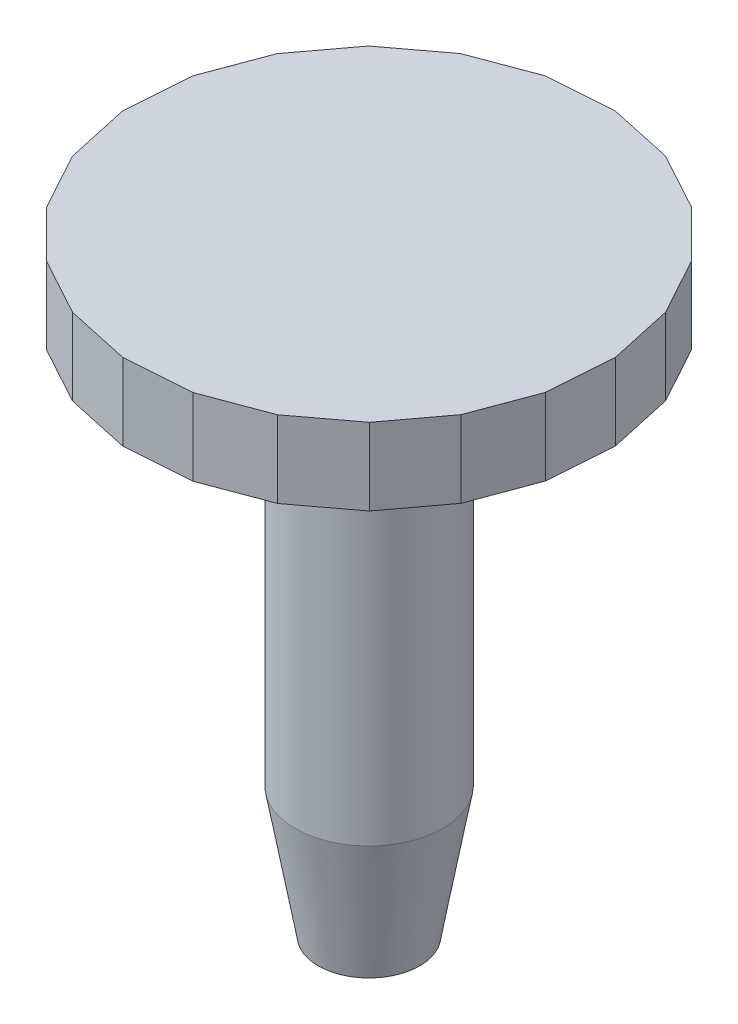
ISO-10303-21;
HEADER;
FILE_DESCRIPTION(('STEP AP214'),'2;1');
FILE_NAME('part.step','',(''),(''),'','','');
FILE_SCHEMA(('AUTOMOTIVE_DESIGN { 1 0 10303 214 1 1 1 1 }'));
ENDSEC;
DATA;
#1=APPLICATION_CONTEXT('core data for automotive mechanical design processes');
#2=APPLICATION_PROTOCOL_DEFINITION('international standard','automotive_design',2000,#1);
#3=PRODUCT_CONTEXT('',#1,'mechanical');
#4=PRODUCT('Part','Part','',(#3));
#5=PRODUCT_RELATED_PRODUCT_CATEGORY('part','',(#4));
#6=PRODUCT_DEFINITION_FORMATION('','',#4);
#7=PRODUCT_DEFINITION_CONTEXT('part definition',#1,'design');
#8=PRODUCT_DEFINITION('design','',#6,#7);
#9=PRODUCT_DEFINITION_SHAPE('','',#8);
#10=(LENGTH_UNIT() NAMED_UNIT(*) SI_UNIT(.MILLI.,.METRE.));
#11=(NAMED_UNIT(*) PLANE_ANGLE_UNIT() SI_UNIT($,.RADIAN.));
#12=(NAMED_UNIT(*) SI_UNIT($,.STERADIAN.) SOLID_ANGLE_UNIT());
#13=UNCERTAINTY_MEASURE_WITH_UNIT(LENGTH_MEASURE(1.E-05),#10,'distance_accuracy_value','');
#14=(GEOMETRIC_REPRESENTATION_CONTEXT(3) GLOBAL_UNCERTAINTY_ASSIGNED_CONTEXT((#13)) GLOBAL_UNIT_ASSIGNED_CONTEXT((#10,
#11,#12)) REPRESENTATION_CONTEXT('',''));
#15=CARTESIAN_POINT('',(0.,0.,0.));
#16=DIRECTION('',(0.,0.,1.));
#17=DIRECTION('',(1.,0.,0.));
#18=AXIS2_PLACEMENT_3D('',#15,#16,#17);
#19=CARTESIAN_POINT('',(0.,0.,0.));
#20=DIRECTION('',(0.,1.,0.));
#21=DIRECTION('',(0.,0.,1.));
#22=AXIS2_PLACEMENT_3D('',#19,#20,#21);
#23=CONICAL_SURFACE('',#22,3.048,0.174532925199433);
#24=CARTESIAN_POINT('',(0.,-5.3975,0.));
#25=DIRECTION('',(0.,1.,0.));
#26=DIRECTION('',(0.,0.,1.));
#27=AXIS2_PLACEMENT_3D('',#24,#25,#26);
#28=CIRCLE('',#27,2.09627512162606);
#29=CARTESIAN_POINT('',(0.,-5.3975,2.09627512162606));
#30=VERTEX_POINT('',#29);
#31=EDGE_CURVE('E11',#30,#30,#28,.T.);
#32=ORIENTED_EDGE('',*,*,#31,.T.);
#33=EDGE_LOOP('',(#32));
#34=FACE_BOUND('',#33,.T.);
#35=CARTESIAN_POINT('',(0.,0.,0.));
#36=DIRECTION('',(0.,1.,0.));
#37=DIRECTION('',(0.,0.,1.));
#38=AXIS2_PLACEMENT_3D('',#35,#36,#37);
#39=CIRCLE('',#38,3.048);
#40=CARTESIAN_POINT('',(0.,0.,3.048));
#41=VERTEX_POINT('',#40);
#42=EDGE_CURVE('E48',#41,#41,#39,.T.);
#43=ORIENTED_EDGE('',*,*,#42,.F.);
#44=EDGE_LOOP('',(#43));
#45=FACE_BOUND('',#44,.T.);
#46=ADVANCED_FACE('F39',(#34,#45),#23,.T.);
#47=CARTESIAN_POINT('',(0.,-5.3975,0.));
#48=DIRECTION('',(0.,1.,0.));
#49=DIRECTION('',(0.,0.,1.));
#50=AXIS2_PLACEMENT_3D('',#47,#48,#49);
#51=PLANE('',#50);
#52=ORIENTED_EDGE('',*,*,#31,.F.);
#53=EDGE_LOOP('',(#52));
#54=FACE_BOUND('',#53,.T.);
#55=ADVANCED_FACE('F381',(#54),#51,.F.);
#56=CARTESIAN_POINT('',(0.,14.986,0.));
#57=DIRECTION('',(0.,-1.,0.));
#58=DIRECTION('',(0.,0.,-1.));
#59=AXIS2_PLACEMENT_3D('',#56,#57,#58);
#60=CYLINDRICAL_SURFACE('',#59,3.048);
#61=CARTESIAN_POINT('',(0.,14.986,0.));
#62=DIRECTION('',(0.,1.,0.));
#63=DIRECTION('',(0.,0.,1.));
#64=AXIS2_PLACEMENT_3D('',#61,#62,#63);
#65=CIRCLE('',#64,3.048);
#66=CARTESIAN_POINT('',(0.,14.986,3.048));
#67=VERTEX_POINT('',#66);
#68=EDGE_CURVE('E371',#67,#67,#65,.T.);
#69=ORIENTED_EDGE('',*,*,#68,.F.);
#70=EDGE_LOOP('',(#69));
#71=FACE_BOUND('',#70,.T.);
#72=ORIENTED_EDGE('',*,*,#42,.T.);
#73=EDGE_LOOP('',(#72));
#74=FACE_BOUND('',#73,.T.);
#75=ADVANCED_FACE('F378',(#71,#74),#60,.T.);
#76=CARTESIAN_POINT('',(0.,14.986,0.));
#77=DIRECTION('',(0.,1.,0.));
#78=DIRECTION('',(0.,0.,1.));
#79=AXIS2_PLACEMENT_3D('',#76,#77,#78);
#80=CONICAL_SURFACE('',#79,3.048,1.30899693899575);
#81=CARTESIAN_POINT('',(0.,16.5735,0.));
#82=DIRECTION('',(0.,1.,0.));
#83=DIRECTION('',(0.,0.,1.));
#84=AXIS2_PLACEMENT_3D('',#81,#82,#83);
#85=CIRCLE('',#84,8.97263065701564);
#86=CARTESIAN_POINT('',(0.,16.5735,8.97263065701564));
#87=VERTEX_POINT('',#86);
#88=EDGE_CURVE('E367',#87,#87,#85,.T.);
#89=ORIENTED_EDGE('',*,*,#88,.F.);
#90=EDGE_LOOP('',(#89));
#91=FACE_BOUND('',#90,.T.);
#92=ORIENTED_EDGE('',*,*,#68,.T.);
#93=EDGE_LOOP('',(#92));
#94=FACE_BOUND('',#93,.T.);
#95=ADVANCED_FACE('F391',(#91,#94),#80,.T.);
#96=CARTESIAN_POINT('',(5.69900035977122,19.7485,-7.63197352585343));
#97=DIRECTION('',(-0.478199440981718,0.,0.878251270790297));
#98=DIRECTION('',(0.878251270790298,0.,0.478199440981718));
#99=AXIS2_PLACEMENT_3D('',#96,#97,#98);
#100=PLANE('',#99);
#101=DIRECTION('',(-0.878251270790298,0.,-0.478199440981718));
#102=VECTOR('',#101,1.);
#103=CARTESIAN_POINT('',(5.69900035977122,16.5735,-7.63197352585343));
#104=LINE('',#103,#102);
#105=CARTESIAN_POINT('',(5.69900035977122,16.5735,-7.63197352585343));
#106=VERTEX_POINT('',#105);
#107=CARTESIAN_POINT('',(3.31797538664219,16.5735,-8.9284189156668));
#108=VERTEX_POINT('',#107);
#109=EDGE_CURVE('E225',#106,#108,#104,.T.);
#110=ORIENTED_EDGE('',*,*,#109,.T.);
#111=DIRECTION('',(0.,-1.,0.));
#112=VECTOR('',#111,1.);
#113=CARTESIAN_POINT('',(3.31797538664219,19.7485,-8.9284189156668));
#114=LINE('',#113,#112);
#115=CARTESIAN_POINT('',(3.31797538664219,19.7485,-8.9284189156668));
#116=VERTEX_POINT('',#115);
#117=EDGE_CURVE('E364',#116,#108,#114,.T.);
#118=ORIENTED_EDGE('',*,*,#117,.F.);
#119=DIRECTION('',(-0.878251270790298,0.,-0.478199440981718));
#120=VECTOR('',#119,1.);
#121=CARTESIAN_POINT('',(5.69900035977122,19.7485,-7.63197352585343));
#122=LINE('',#121,#120);
#123=CARTESIAN_POINT('',(5.69900035977122,19.7485,-7.63197352585343));
#124=VERTEX_POINT('',#123);
#125=EDGE_CURVE('E289',#124,#116,#122,.T.);
#126=ORIENTED_EDGE('',*,*,#125,.F.);
#127=DIRECTION('',(0.,-1.,0.));
#128=VECTOR('',#127,1.);
#129=CARTESIAN_POINT('',(5.69900035977122,19.7485,-7.63197352585343));
#130=LINE('',#129,#128);
#131=EDGE_CURVE('E221',#124,#106,#130,.T.);
#132=ORIENTED_EDGE('',*,*,#131,.T.);
#133=EDGE_LOOP('',(#110,#118,#126,#132));
#134=FACE_BOUND('',#133,.T.);
#135=ADVANCED_FACE('F397',(#134),#100,.F.);
#136=CARTESIAN_POINT('',(3.31797538664219,19.7485,-8.9284189156668));
#137=DIRECTION('',(-0.211397027539353,0.,0.977400274579216));
#138=DIRECTION('',(0.977400274579216,0.,0.211397027539353));
#139=AXIS2_PLACEMENT_3D('',#136,#137,#138);
#140=PLANE('',#139);
#141=DIRECTION('',(-0.977400274579216,0.,-0.211397027539353));
#142=VECTOR('',#141,1.);
#143=CARTESIAN_POINT('',(3.31797538664219,16.5735,-8.9284189156668));
#144=LINE('',#143,#142);
#145=CARTESIAN_POINT('',(0.668147780446827,16.5735,-9.5015369042847));
#146=VERTEX_POINT('',#145);
#147=EDGE_CURVE('E229',#108,#146,#144,.T.);
#148=ORIENTED_EDGE('',*,*,#147,.T.);
#149=DIRECTION('',(0.,-1.,0.));
#150=VECTOR('',#149,1.);
#151=CARTESIAN_POINT('',(0.668147780446827,19.7485,-9.5015369042847));
#152=LINE('',#151,#150);
#153=CARTESIAN_POINT('',(0.668147780446827,19.7485,-9.5015369042847));
#154=VERTEX_POINT('',#153);
#155=EDGE_CURVE('E360',#154,#146,#152,.T.);
#156=ORIENTED_EDGE('',*,*,#155,.F.);
#157=DIRECTION('',(-0.977400274579216,0.,-0.211397027539353));
#158=VECTOR('',#157,1.);
#159=CARTESIAN_POINT('',(3.31797538664219,19.7485,-8.9284189156668));
#160=LINE('',#159,#158);
#161=EDGE_CURVE('E142',#116,#154,#160,.T.);
#162=ORIENTED_EDGE('',*,*,#161,.F.);
#163=ORIENTED_EDGE('',*,*,#117,.T.);
#164=EDGE_LOOP('',(#148,#156,#162,#163));
#165=FACE_BOUND('',#164,.T.);
#166=ADVANCED_FACE('F401',(#165),#140,.F.);
#167=CARTESIAN_POINT('',(0.668147780446827,19.7485,-9.5015369042847));
#168=DIRECTION('',(0.0725315158477178,0.,0.997366120944978));
#169=DIRECTION('',(0.997366120944978,0.,-0.0725315158477178));
#170=AXIS2_PLACEMENT_3D('',#167,#168,#169);
#171=PLANE('',#170);
#172=DIRECTION('',(-0.997366120944978,0.,0.0725315158477179));
#173=VECTOR('',#172,1.);
#174=CARTESIAN_POINT('',(0.668147780446827,16.5735,-9.5015369042847));
#175=LINE('',#174,#173);
#176=CARTESIAN_POINT('',(-2.03580918529249,16.5735,-9.30489688073322));
#177=VERTEX_POINT('',#176);
#178=EDGE_CURVE('E232',#146,#177,#175,.T.);
#179=ORIENTED_EDGE('',*,*,#178,.T.);
#180=DIRECTION('',(0.,-1.,0.));
#181=VECTOR('',#180,1.);
#182=CARTESIAN_POINT('',(-2.03580918529249,19.7485,-9.30489688073322));
#183=LINE('',#182,#181);
#184=CARTESIAN_POINT('',(-2.03580918529249,19.7485,-9.30489688073322));
#185=VERTEX_POINT('',#184);
#186=EDGE_CURVE('E356',#185,#177,#183,.T.);
#187=ORIENTED_EDGE('',*,*,#186,.F.);
#188=DIRECTION('',(-0.997366120944978,0.,0.0725315158477179));
#189=VECTOR('',#188,1.);
#190=CARTESIAN_POINT('',(0.668147780446827,19.7485,-9.5015369042847));
#191=LINE('',#190,#189);
#192=EDGE_CURVE('E658',#154,#185,#191,.T.);
#193=ORIENTED_EDGE('',*,*,#192,.F.);
#194=ORIENTED_EDGE('',*,*,#155,.T.);
#195=EDGE_LOOP('',(#179,#187,#193,#194));
#196=FACE_BOUND('',#195,.T.);
#197=ADVANCED_FACE('F405',(#196),#171,.F.);
#198=CARTESIAN_POINT('',(-2.03580918529249,19.7485,-9.30489688073322));
#199=DIRECTION('',(0.350583987182341,0.,0.936531295756491));
#200=DIRECTION('',(0.936531295756491,0.,-0.350583987182341));
#201=AXIS2_PLACEMENT_3D('',#198,#199,#200);
#202=PLANE('',#201);
#203=DIRECTION('',(-0.936531295756491,0.,0.350583987182341));
#204=VECTOR('',#203,1.);
#205=CARTESIAN_POINT('',(-2.03580918529249,16.5735,-9.30489688073322));
#206=LINE('',#205,#204);
#207=CARTESIAN_POINT('',(-4.57483699826281,16.5735,-8.35442945025726));
#208=VERTEX_POINT('',#207);
#209=EDGE_CURVE('E235',#177,#208,#206,.T.);
#210=ORIENTED_EDGE('',*,*,#209,.T.);
#211=DIRECTION('',(0.,-1.,0.));
#212=VECTOR('',#211,1.);
#213=CARTESIAN_POINT('',(-4.57483699826281,19.7485,-8.35442945025726));
#214=LINE('',#213,#212);
#215=CARTESIAN_POINT('',(-4.57483699826281,19.7485,-8.35442945025726));
#216=VERTEX_POINT('',#215);
#217=EDGE_CURVE('E352',#216,#208,#214,.T.);
#218=ORIENTED_EDGE('',*,*,#217,.F.);
#219=DIRECTION('',(-0.936531295756491,0.,0.350583987182341));
#220=VECTOR('',#219,1.);
#221=CARTESIAN_POINT('',(-2.03580918529249,19.7485,-9.30489688073322));
#222=LINE('',#221,#220);
#223=EDGE_CURVE('E663',#185,#216,#222,.T.);
#224=ORIENTED_EDGE('',*,*,#223,.F.);
#225=ORIENTED_EDGE('',*,*,#186,.T.);
#226=EDGE_LOOP('',(#210,#218,#224,#225));
#227=FACE_BOUND('',#226,.T.);
#228=ADVANCED_FACE('F408',(#227),#202,.F.);
#229=CARTESIAN_POINT('',(-4.57483699826281,19.7485,-8.35442945025726));
#230=DIRECTION('',(0.600234228878704,0.,0.79982427475189));
#231=DIRECTION('',(0.79982427475189,0.,-0.600234228878704));
#232=AXIS2_PLACEMENT_3D('',#229,#230,#231);
#233=PLANE('',#232);
#234=DIRECTION('',(-0.79982427475189,0.,0.600234228878704));
#235=VECTOR('',#234,1.);
#236=CARTESIAN_POINT('',(-4.57483699826281,16.5735,-8.35442945025726));
#237=LINE('',#236,#235);
#238=CARTESIAN_POINT('',(-6.74323872523712,16.5735,-6.72713583142652));
#239=VERTEX_POINT('',#238);
#240=EDGE_CURVE('E238',#208,#239,#237,.T.);
#241=ORIENTED_EDGE('',*,*,#240,.T.);
#242=DIRECTION('',(0.,-1.,0.));
#243=VECTOR('',#242,1.);
#244=CARTESIAN_POINT('',(-6.74323872523712,19.7485,-6.72713583142652));
#245=LINE('',#244,#243);
#246=CARTESIAN_POINT('',(-6.74323872523712,19.7485,-6.72713583142652));
#247=VERTEX_POINT('',#246);
#248=EDGE_CURVE('E348',#247,#239,#245,.T.);
#249=ORIENTED_EDGE('',*,*,#248,.F.);
#250=DIRECTION('',(-0.79982427475189,0.,0.600234228878704));
#251=VECTOR('',#250,1.);
#252=CARTESIAN_POINT('',(-4.57483699826281,19.7485,-8.35442945025726));
#253=LINE('',#252,#251);
#254=EDGE_CURVE('E666',#216,#247,#253,.T.);
#255=ORIENTED_EDGE('',*,*,#254,.F.);
#256=ORIENTED_EDGE('',*,*,#217,.T.);
#257=EDGE_LOOP('',(#241,#249,#255,#256));
#258=FACE_BOUND('',#257,.T.);
#259=ADVANCED_FACE('F412',(#258),#233,.F.);
#260=CARTESIAN_POINT('',(-6.74323872523712,19.7485,-6.72713583142652));
#261=DIRECTION('',(0.801257063081725,0.,0.598320247745008));
#262=DIRECTION('',(0.598320247745008,0.,-0.801257063081726));
#263=AXIS2_PLACEMENT_3D('',#260,#261,#262);
#264=PLANE('',#263);
#265=DIRECTION('',(-0.598320247745008,0.,0.801257063081725));
#266=VECTOR('',#265,1.);
#267=CARTESIAN_POINT('',(-6.74323872523712,16.5735,-6.72713583142652));
#268=LINE('',#267,#266);
#269=CARTESIAN_POINT('',(-8.36534335427759,16.5735,-4.55484967535086));
#270=VERTEX_POINT('',#269);
#271=EDGE_CURVE('E241',#239,#270,#268,.T.);
#272=ORIENTED_EDGE('',*,*,#271,.T.);
#273=DIRECTION('',(0.,-1.,0.));
#274=VECTOR('',#273,1.);
#275=CARTESIAN_POINT('',(-8.36534335427759,19.7485,-4.55484967535086));
#276=LINE('',#275,#274);
#277=CARTESIAN_POINT('',(-8.36534335427759,19.7485,-4.55484967535086));
#278=VERTEX_POINT('',#277);
#279=EDGE_CURVE('E344',#278,#270,#276,.T.);
#280=ORIENTED_EDGE('',*,*,#279,.F.);
#281=DIRECTION('',(-0.598320247745008,0.,0.801257063081725));
#282=VECTOR('',#281,1.);
#283=CARTESIAN_POINT('',(-6.74323872523712,19.7485,-6.72713583142652));
#284=LINE('',#283,#282);
#285=EDGE_CURVE('E669',#247,#278,#284,.T.);
#286=ORIENTED_EDGE('',*,*,#285,.F.);
#287=ORIENTED_EDGE('',*,*,#248,.T.);
#288=EDGE_LOOP('',(#272,#280,#286,#287));
#289=FACE_BOUND('',#288,.T.);
#290=ADVANCED_FACE('F416',(#289),#264,.F.);
#291=CARTESIAN_POINT('',(-8.36534335427759,19.7485,-4.55484967535086));
#292=DIRECTION('',(0.937366815293102,0.,0.348343872613352));
#293=DIRECTION('',(0.348343872613352,0.,-0.937366815293103));
#294=AXIS2_PLACEMENT_3D('',#291,#292,#293);
#295=PLANE('',#294);
#296=DIRECTION('',(-0.348343872613352,0.,0.937366815293102));
#297=VECTOR('',#296,1.);
#298=CARTESIAN_POINT('',(-8.36534335427759,16.5735,-4.55484967535086));
#299=LINE('',#298,#297);
#300=CARTESIAN_POINT('',(-9.30973761536703,16.5735,-2.01355668731235));
#301=VERTEX_POINT('',#300);
#302=EDGE_CURVE('E244',#270,#301,#299,.T.);
#303=ORIENTED_EDGE('',*,*,#302,.T.);
#304=DIRECTION('',(0.,-1.,0.));
#305=VECTOR('',#304,1.);
#306=CARTESIAN_POINT('',(-9.30973761536703,19.7485,-2.01355668731235));
#307=LINE('',#306,#305);
#308=CARTESIAN_POINT('',(-9.30973761536703,19.7485,-2.01355668731235));
#309=VERTEX_POINT('',#308);
#310=EDGE_CURVE('E340',#309,#301,#307,.T.);
#311=ORIENTED_EDGE('',*,*,#310,.F.);
#312=DIRECTION('',(-0.348343872613352,0.,0.937366815293102));
#313=VECTOR('',#312,1.);
#314=CARTESIAN_POINT('',(-8.36534335427759,19.7485,-4.55484967535086));
#315=LINE('',#314,#313);
#316=EDGE_CURVE('E672',#278,#309,#315,.T.);
#317=ORIENTED_EDGE('',*,*,#316,.F.);
#318=ORIENTED_EDGE('',*,*,#279,.T.);
#319=EDGE_LOOP('',(#303,#311,#317,#318));
#320=FACE_BOUND('',#319,.T.);
#321=ADVANCED_FACE('F420',(#320),#295,.F.);
#322=CARTESIAN_POINT('',(-9.30973761536703,19.7485,-2.01355668731235));
#323=DIRECTION('',(0.997536682864535,0.,0.0701467486033408));
#324=DIRECTION('',(0.0701467486033408,0.,-0.997536682864535));
#325=AXIS2_PLACEMENT_3D('',#322,#323,#324);
#326=PLANE('',#325);
#327=DIRECTION('',(-0.0701467486033408,0.,0.997536682864535));
#328=VECTOR('',#327,1.);
#329=CARTESIAN_POINT('',(-9.30973761536703,16.5735,-2.01355668731235));
#330=LINE('',#329,#328);
#331=CARTESIAN_POINT('',(-9.49991230200092,16.5735,0.690862688449515));
#332=VERTEX_POINT('',#331);
#333=EDGE_CURVE('E247',#301,#332,#330,.T.);
#334=ORIENTED_EDGE('',*,*,#333,.T.);
#335=DIRECTION('',(0.,-1.,0.));
#336=VECTOR('',#335,1.);
#337=CARTESIAN_POINT('',(-9.49991230200092,19.7485,0.690862688449515));
#338=LINE('',#337,#336);
#339=CARTESIAN_POINT('',(-9.49991230200092,19.7485,0.690862688449515));
#340=VERTEX_POINT('',#339);
#341=EDGE_CURVE('E336',#340,#332,#338,.T.);
#342=ORIENTED_EDGE('',*,*,#341,.F.);
#343=DIRECTION('',(-0.0701467486033408,0.,0.997536682864535));
#344=VECTOR('',#343,1.);
#345=CARTESIAN_POINT('',(-9.30973761536703,19.7485,-2.01355668731235));
#346=LINE('',#345,#344);
#347=EDGE_CURVE('E675',#309,#340,#346,.T.);
#348=ORIENTED_EDGE('',*,*,#347,.F.);
#349=ORIENTED_EDGE('',*,*,#310,.T.);
#350=EDGE_LOOP('',(#334,#342,#348,#349));
#351=FACE_BOUND('',#350,.T.);
#352=ADVANCED_FACE('F424',(#351),#326,.F.);
#353=CARTESIAN_POINT('',(-9.49991230200092,19.7485,0.690862688449515));
#354=DIRECTION('',(0.976892060969367,0.,-0.213733247799736));
#355=DIRECTION('',(-0.213733247799736,0.,-0.976892060969367));
#356=AXIS2_PLACEMENT_3D('',#353,#354,#355);
#357=PLANE('',#356);
#358=DIRECTION('',(0.213733247799736,0.,0.976892060969367));
#359=VECTOR('',#358,1.);
#360=CARTESIAN_POINT('',(-9.49991230200092,16.5735,0.690862688449515));
#361=LINE('',#360,#359);
#362=CARTESIAN_POINT('',(-8.92046059208058,16.5735,3.3393124779118));
#363=VERTEX_POINT('',#362);
#364=EDGE_CURVE('E250',#332,#363,#361,.T.);
#365=ORIENTED_EDGE('',*,*,#364,.T.);
#366=DIRECTION('',(0.,-1.,0.));
#367=VECTOR('',#366,1.);
#368=CARTESIAN_POINT('',(-8.92046059208058,19.7485,3.3393124779118));
#369=LINE('',#368,#367);
#370=CARTESIAN_POINT('',(-8.92046059208058,19.7485,3.3393124779118));
#371=VERTEX_POINT('',#370);
#372=EDGE_CURVE('E332',#371,#363,#369,.T.);
#373=ORIENTED_EDGE('',*,*,#372,.F.);
#374=DIRECTION('',(0.213733247799736,0.,0.976892060969367));
#375=VECTOR('',#374,1.);
#376=CARTESIAN_POINT('',(-9.49991230200092,19.7485,0.690862688449515));
#377=LINE('',#376,#375);
#378=EDGE_CURVE('E678',#340,#371,#377,.T.);
#379=ORIENTED_EDGE('',*,*,#378,.F.);
#380=ORIENTED_EDGE('',*,*,#341,.T.);
#381=EDGE_LOOP('',(#365,#373,#379,#380));
#382=FACE_BOUND('',#381,.T.);
#383=ADVANCED_FACE('F428',(#382),#357,.F.);
#384=CARTESIAN_POINT('',(-8.92046059208058,19.7485,3.3393124779118));
#385=DIRECTION('',(0.87710545409525,0.,-0.480297847586646));
#386=DIRECTION('',(-0.480297847586646,0.,-0.87710545409525));
#387=AXIS2_PLACEMENT_3D('',#384,#385,#386);
#388=PLANE('',#387);
#389=DIRECTION('',(0.480297847586646,0.,0.87710545409525));
#390=VECTOR('',#389,1.);
#391=CARTESIAN_POINT('',(-8.92046059208058,16.5735,3.3393124779118));
#392=LINE('',#391,#390);
#393=CARTESIAN_POINT('',(-7.61832621701175,16.5735,5.71723103006966));
#394=VERTEX_POINT('',#393);
#395=EDGE_CURVE('E253',#363,#394,#392,.T.);
#396=ORIENTED_EDGE('',*,*,#395,.T.);
#397=DIRECTION('',(0.,-1.,0.));
#398=VECTOR('',#397,1.);
#399=CARTESIAN_POINT('',(-7.61832621701175,19.7485,5.71723103006966));
#400=LINE('',#399,#398);
#401=CARTESIAN_POINT('',(-7.61832621701175,19.7485,5.71723103006966));
#402=VERTEX_POINT('',#401);
#403=EDGE_CURVE('E328',#402,#394,#400,.T.);
#404=ORIENTED_EDGE('',*,*,#403,.F.);
#405=DIRECTION('',(0.480297847586646,0.,0.87710545409525));
#406=VECTOR('',#405,1.);
#407=CARTESIAN_POINT('',(-8.92046059208058,19.7485,3.3393124779118));
#408=LINE('',#407,#406);
#409=EDGE_CURVE('E681',#371,#402,#408,.T.);
#410=ORIENTED_EDGE('',*,*,#409,.F.);
#411=ORIENTED_EDGE('',*,*,#372,.T.);
#412=EDGE_LOOP('',(#396,#404,#410,#411));
#413=FACE_BOUND('',#412,.T.);
#414=ADVANCED_FACE('F432',(#413),#388,.F.);
#415=CARTESIAN_POINT('',(-7.61832621701175,19.7485,5.71723103006966));
#416=DIRECTION('',(0.706260979677324,0.,-0.707951572203372));
#417=DIRECTION('',(-0.707951572203372,0.,-0.706260979677324));
#418=AXIS2_PLACEMENT_3D('',#415,#416,#417);
#419=PLANE('',#418);
#420=DIRECTION('',(0.707951572203372,0.,0.706260979677324));
#421=VECTOR('',#420,1.);
#422=CARTESIAN_POINT('',(-7.61832621701175,16.5735,5.71723103006966));
#423=LINE('',#422,#421);
#424=CARTESIAN_POINT('',(-5.6990003597712,16.5735,7.63197352585344));
#425=VERTEX_POINT('',#424);
#426=EDGE_CURVE('E256',#394,#425,#423,.T.);
#427=ORIENTED_EDGE('',*,*,#426,.T.);
#428=DIRECTION('',(0.,-1.,0.));
#429=VECTOR('',#428,1.);
#430=CARTESIAN_POINT('',(-5.6990003597712,19.7485,7.63197352585344));
#431=LINE('',#430,#429);
#432=CARTESIAN_POINT('',(-5.6990003597712,19.7485,7.63197352585344));
#433=VERTEX_POINT('',#432);
#434=EDGE_CURVE('E324',#433,#425,#431,.T.);
#435=ORIENTED_EDGE('',*,*,#434,.F.);
#436=DIRECTION('',(0.707951572203372,0.,0.706260979677324));
#437=VECTOR('',#436,1.);
#438=CARTESIAN_POINT('',(-7.61832621701175,19.7485,5.71723103006966));
#439=LINE('',#438,#437);
#440=EDGE_CURVE('E684',#402,#433,#439,.T.);
#441=ORIENTED_EDGE('',*,*,#440,.F.);
#442=ORIENTED_EDGE('',*,*,#403,.T.);
#443=EDGE_LOOP('',(#427,#435,#441,#442));
#444=FACE_BOUND('',#443,.T.);
#445=ADVANCED_FACE('F436',(#444),#419,.F.);
#446=CARTESIAN_POINT('',(-5.6990003597712,19.7485,7.63197352585344));
#447=DIRECTION('',(0.478199440981718,0.,-0.878251270790298));
#448=DIRECTION('',(-0.878251270790298,0.,-0.478199440981718));
#449=AXIS2_PLACEMENT_3D('',#446,#447,#448);
#450=PLANE('',#449);
#451=DIRECTION('',(0.878251270790297,0.,0.478199440981718));
#452=VECTOR('',#451,1.);
#453=CARTESIAN_POINT('',(-5.6990003597712,16.5735,7.63197352585344));
#454=LINE('',#453,#452);
#455=CARTESIAN_POINT('',(-3.31797538664217,16.5735,8.92841891566681));
#456=VERTEX_POINT('',#455);
#457=EDGE_CURVE('E259',#425,#456,#454,.T.);
#458=ORIENTED_EDGE('',*,*,#457,.T.);
#459=DIRECTION('',(0.,-1.,0.));
#460=VECTOR('',#459,1.);
#461=CARTESIAN_POINT('',(-3.31797538664217,19.7485,8.92841891566681));
#462=LINE('',#461,#460);
#463=CARTESIAN_POINT('',(-3.31797538664217,19.7485,8.92841891566681));
#464=VERTEX_POINT('',#463);
#465=EDGE_CURVE('E320',#464,#456,#462,.T.);
#466=ORIENTED_EDGE('',*,*,#465,.F.);
#467=DIRECTION('',(0.878251270790297,0.,0.478199440981718));
#468=VECTOR('',#467,1.);
#469=CARTESIAN_POINT('',(-5.6990003597712,19.7485,7.63197352585344));
#470=LINE('',#469,#468);
#471=EDGE_CURVE('E687',#433,#464,#470,.T.);
#472=ORIENTED_EDGE('',*,*,#471,.F.);
#473=ORIENTED_EDGE('',*,*,#434,.T.);
#474=EDGE_LOOP('',(#458,#466,#472,#473));
#475=FACE_BOUND('',#474,.T.);
#476=ADVANCED_FACE('F440',(#475),#450,.F.);
#477=CARTESIAN_POINT('',(-3.31797538664217,19.7485,8.92841891566681));
#478=DIRECTION('',(0.211397027539353,0.,-0.977400274579216));
#479=DIRECTION('',(-0.977400274579216,0.,-0.211397027539353));
#480=AXIS2_PLACEMENT_3D('',#477,#478,#479);
#481=PLANE('',#480);
#482=DIRECTION('',(0.977400274579216,0.,0.211397027539353));
#483=VECTOR('',#482,1.);
#484=CARTESIAN_POINT('',(-3.31797538664217,16.5735,8.92841891566681));
#485=LINE('',#484,#483);
#486=CARTESIAN_POINT('',(-0.668147780446794,16.5735,9.50153690428471));
#487=VERTEX_POINT('',#486);
#488=EDGE_CURVE('E262',#456,#487,#485,.T.);
#489=ORIENTED_EDGE('',*,*,#488,.T.);
#490=DIRECTION('',(0.,-1.,0.));
#491=VECTOR('',#490,1.);
#492=CARTESIAN_POINT('',(-0.668147780446794,19.7485,9.50153690428471));
#493=LINE('',#492,#491);
#494=CARTESIAN_POINT('',(-0.668147780446794,19.7485,9.50153690428471));
#495=VERTEX_POINT('',#494);
#496=EDGE_CURVE('E316',#495,#487,#493,.T.);
#497=ORIENTED_EDGE('',*,*,#496,.F.);
#498=DIRECTION('',(0.977400274579216,0.,0.211397027539353));
#499=VECTOR('',#498,1.);
#500=CARTESIAN_POINT('',(-3.31797538664217,19.7485,8.92841891566681));
#501=LINE('',#500,#499);
#502=EDGE_CURVE('E690',#464,#495,#501,.T.);
#503=ORIENTED_EDGE('',*,*,#502,.F.);
#504=ORIENTED_EDGE('',*,*,#465,.T.);
#505=EDGE_LOOP('',(#489,#497,#503,#504));
#506=FACE_BOUND('',#505,.T.);
#507=ADVANCED_FACE('F444',(#506),#481,.F.);
#508=CARTESIAN_POINT('',(-0.668147780446794,19.7485,9.50153690428471));
#509=DIRECTION('',(-0.0725315158477181,0.,-0.997366120944978));
#510=DIRECTION('',(-0.997366120944978,0.,0.0725315158477181));
#511=AXIS2_PLACEMENT_3D('',#508,#509,#510);
#512=PLANE('',#511);
#513=DIRECTION('',(0.997366120944978,0.,-0.0725315158477181));
#514=VECTOR('',#513,1.);
#515=CARTESIAN_POINT('',(-0.668147780446794,16.5735,9.50153690428471));
#516=LINE('',#515,#514);
#517=CARTESIAN_POINT('',(2.03580918529249,16.5735,9.30489688073323));
#518=VERTEX_POINT('',#517);
#519=EDGE_CURVE('E265',#487,#518,#516,.T.);
#520=ORIENTED_EDGE('',*,*,#519,.T.);
#521=DIRECTION('',(0.,-1.,0.));
#522=VECTOR('',#521,1.);
#523=CARTESIAN_POINT('',(2.03580918529249,19.7485,9.30489688073323));
#524=LINE('',#523,#522);
#525=CARTESIAN_POINT('',(2.03580918529249,19.7485,9.30489688073323));
#526=VERTEX_POINT('',#525);
#527=EDGE_CURVE('E312',#526,#518,#524,.T.);
#528=ORIENTED_EDGE('',*,*,#527,.F.);
#529=DIRECTION('',(0.997366120944978,0.,-0.0725315158477181));
#530=VECTOR('',#529,1.);
#531=CARTESIAN_POINT('',(-0.668147780446794,19.7485,9.50153690428471));
#532=LINE('',#531,#530);
#533=EDGE_CURVE('E693',#495,#526,#532,.T.);
#534=ORIENTED_EDGE('',*,*,#533,.F.);
#535=ORIENTED_EDGE('',*,*,#496,.T.);
#536=EDGE_LOOP('',(#520,#528,#534,#535));
#537=FACE_BOUND('',#536,.T.);
#538=ADVANCED_FACE('F448',(#537),#512,.F.);
#539=CARTESIAN_POINT('',(2.03580918529249,19.7485,9.30489688073323));
#540=DIRECTION('',(-0.350583987182343,0.,-0.93653129575649));
#541=DIRECTION('',(-0.93653129575649,0.,0.350583987182343));
#542=AXIS2_PLACEMENT_3D('',#539,#540,#541);
#543=PLANE('',#542);
#544=DIRECTION('',(0.93653129575649,0.,-0.350583987182343));
#545=VECTOR('',#544,1.);
#546=CARTESIAN_POINT('',(2.03580918529249,16.5735,9.30489688073323));
#547=LINE('',#546,#545);
#548=CARTESIAN_POINT('',(4.57483699826281,16.5735,8.35442945025726));
#549=VERTEX_POINT('',#548);
#550=EDGE_CURVE('E268',#518,#549,#547,.T.);
#551=ORIENTED_EDGE('',*,*,#550,.T.);
#552=DIRECTION('',(0.,-1.,0.));
#553=VECTOR('',#552,1.);
#554=CARTESIAN_POINT('',(4.57483699826281,19.7485,8.35442945025726));
#555=LINE('',#554,#553);
#556=CARTESIAN_POINT('',(4.57483699826281,19.7485,8.35442945025726));
#557=VERTEX_POINT('',#556);
#558=EDGE_CURVE('E308',#557,#549,#555,.T.);
#559=ORIENTED_EDGE('',*,*,#558,.F.);
#560=DIRECTION('',(0.93653129575649,0.,-0.350583987182343));
#561=VECTOR('',#560,1.);
#562=CARTESIAN_POINT('',(2.03580918529249,19.7485,9.30489688073323));
#563=LINE('',#562,#561);
#564=EDGE_CURVE('E696',#526,#557,#563,.T.);
#565=ORIENTED_EDGE('',*,*,#564,.F.);
#566=ORIENTED_EDGE('',*,*,#527,.T.);
#567=EDGE_LOOP('',(#551,#559,#565,#566));
#568=FACE_BOUND('',#567,.T.);
#569=ADVANCED_FACE('F452',(#568),#543,.F.);
#570=CARTESIAN_POINT('',(4.57483699826281,19.7485,8.35442945025726));
#571=DIRECTION('',(-0.600234228878705,0.,-0.79982427475189));
#572=DIRECTION('',(-0.79982427475189,0.,0.600234228878705));
#573=AXIS2_PLACEMENT_3D('',#570,#571,#572);
#574=PLANE('',#573);
#575=DIRECTION('',(0.79982427475189,0.,-0.600234228878705));
#576=VECTOR('',#575,1.);
#577=CARTESIAN_POINT('',(4.57483699826281,16.5735,8.35442945025726));
#578=LINE('',#577,#576);
#579=CARTESIAN_POINT('',(6.74323872523713,16.5735,6.72713583142652));
#580=VERTEX_POINT('',#579);
#581=EDGE_CURVE('E271',#549,#580,#578,.T.);
#582=ORIENTED_EDGE('',*,*,#581,.T.);
#583=DIRECTION('',(0.,-1.,0.));
#584=VECTOR('',#583,1.);
#585=CARTESIAN_POINT('',(6.74323872523713,19.7485,6.72713583142652));
#586=LINE('',#585,#584);
#587=CARTESIAN_POINT('',(6.74323872523713,19.7485,6.72713583142652));
#588=VERTEX_POINT('',#587);
#589=EDGE_CURVE('E304',#588,#580,#586,.T.);
#590=ORIENTED_EDGE('',*,*,#589,.F.);
#591=DIRECTION('',(0.79982427475189,0.,-0.600234228878705));
#592=VECTOR('',#591,1.);
#593=CARTESIAN_POINT('',(4.57483699826281,19.7485,8.35442945025726));
#594=LINE('',#593,#592);
#595=EDGE_CURVE('E699',#557,#588,#594,.T.);
#596=ORIENTED_EDGE('',*,*,#595,.F.);
#597=ORIENTED_EDGE('',*,*,#558,.T.);
#598=EDGE_LOOP('',(#582,#590,#596,#597));
#599=FACE_BOUND('',#598,.T.);
#600=ADVANCED_FACE('F456',(#599),#574,.F.);
#601=CARTESIAN_POINT('',(6.74323872523713,19.7485,6.72713583142652));
#602=DIRECTION('',(-0.801257063081725,0.,-0.598320247745009));
#603=DIRECTION('',(-0.598320247745009,0.,0.801257063081725));
#604=AXIS2_PLACEMENT_3D('',#601,#602,#603);
#605=PLANE('',#604);
#606=DIRECTION('',(0.598320247745009,0.,-0.801257063081725));
#607=VECTOR('',#606,1.);
#608=CARTESIAN_POINT('',(6.74323872523713,16.5735,6.72713583142652));
#609=LINE('',#608,#607);
#610=CARTESIAN_POINT('',(8.36534335427759,16.5735,4.55484967535087));
#611=VERTEX_POINT('',#610);
#612=EDGE_CURVE('E274',#580,#611,#609,.T.);
#613=ORIENTED_EDGE('',*,*,#612,.T.);
#614=DIRECTION('',(0.,-1.,0.));
#615=VECTOR('',#614,1.);
#616=CARTESIAN_POINT('',(8.36534335427759,19.7485,4.55484967535087));
#617=LINE('',#616,#615);
#618=CARTESIAN_POINT('',(8.36534335427759,19.7485,4.55484967535087));
#619=VERTEX_POINT('',#618);
#620=EDGE_CURVE('E300',#619,#611,#617,.T.);
#621=ORIENTED_EDGE('',*,*,#620,.F.);
#622=DIRECTION('',(0.598320247745009,0.,-0.801257063081725));
#623=VECTOR('',#622,1.);
#624=CARTESIAN_POINT('',(6.74323872523713,19.7485,6.72713583142652));
#625=LINE('',#624,#623);
#626=EDGE_CURVE('E702',#588,#619,#625,.T.);
#627=ORIENTED_EDGE('',*,*,#626,.F.);
#628=ORIENTED_EDGE('',*,*,#589,.T.);
#629=EDGE_LOOP('',(#613,#621,#627,#628));
#630=FACE_BOUND('',#629,.T.);
#631=ADVANCED_FACE('F460',(#630),#605,.F.);
#632=CARTESIAN_POINT('',(8.36534335427759,19.7485,4.55484967535087));
#633=DIRECTION('',(-0.937366815293102,0.,-0.348343872613353));
#634=DIRECTION('',(-0.348343872613353,0.,0.937366815293102));
#635=AXIS2_PLACEMENT_3D('',#632,#633,#634);
#636=PLANE('',#635);
#637=DIRECTION('',(0.348343872613353,0.,-0.937366815293102));
#638=VECTOR('',#637,1.);
#639=CARTESIAN_POINT('',(8.36534335427759,16.5735,4.55484967535087));
#640=LINE('',#639,#638);
#641=CARTESIAN_POINT('',(9.30973761536704,16.5735,2.01355668731234));
#642=VERTEX_POINT('',#641);
#643=EDGE_CURVE('E277',#611,#642,#640,.T.);
#644=ORIENTED_EDGE('',*,*,#643,.T.);
#645=DIRECTION('',(0.,-1.,0.));
#646=VECTOR('',#645,1.);
#647=CARTESIAN_POINT('',(9.30973761536704,19.7485,2.01355668731234));
#648=LINE('',#647,#646);
#649=CARTESIAN_POINT('',(9.30973761536704,19.7485,2.01355668731234));
#650=VERTEX_POINT('',#649);
#651=EDGE_CURVE('E296',#650,#642,#648,.T.);
#652=ORIENTED_EDGE('',*,*,#651,.F.);
#653=DIRECTION('',(0.348343872613353,0.,-0.937366815293102));
#654=VECTOR('',#653,1.);
#655=CARTESIAN_POINT('',(8.36534335427759,19.7485,4.55484967535087));
#656=LINE('',#655,#654);
#657=EDGE_CURVE('E705',#619,#650,#656,.T.);
#658=ORIENTED_EDGE('',*,*,#657,.F.);
#659=ORIENTED_EDGE('',*,*,#620,.T.);
#660=EDGE_LOOP('',(#644,#652,#658,#659));
#661=FACE_BOUND('',#660,.T.);
#662=ADVANCED_FACE('F464',(#661),#636,.F.);
#663=CARTESIAN_POINT('',(9.30973761536704,19.7485,2.01355668731234));
#664=DIRECTION('',(-0.997536682864535,0.,-0.0701467486033404));
#665=DIRECTION('',(-0.0701467486033404,0.,0.997536682864535));
#666=AXIS2_PLACEMENT_3D('',#663,#664,#665);
#667=PLANE('',#666);
#668=DIRECTION('',(0.0701467486033404,0.,-0.997536682864535));
#669=VECTOR('',#668,1.);
#670=CARTESIAN_POINT('',(9.30973761536704,16.5735,2.01355668731234));
#671=LINE('',#670,#669);
#672=CARTESIAN_POINT('',(9.49991230200093,16.5735,-0.69086268844951));
#673=VERTEX_POINT('',#672);
#674=EDGE_CURVE('E280',#642,#673,#671,.T.);
#675=ORIENTED_EDGE('',*,*,#674,.T.);
#676=DIRECTION('',(0.,-1.,0.));
#677=VECTOR('',#676,1.);
#678=CARTESIAN_POINT('',(9.49991230200093,19.7485,-0.69086268844951));
#679=LINE('',#678,#677);
#680=CARTESIAN_POINT('',(9.49991230200093,19.7485,-0.69086268844951));
#681=VERTEX_POINT('',#680);
#682=EDGE_CURVE('E214',#681,#673,#679,.T.);
#683=ORIENTED_EDGE('',*,*,#682,.F.);
#684=DIRECTION('',(0.0701467486033404,0.,-0.997536682864535));
#685=VECTOR('',#684,1.);
#686=CARTESIAN_POINT('',(9.30973761536704,19.7485,2.01355668731234));
#687=LINE('',#686,#685);
#688=EDGE_CURVE('E203',#650,#681,#687,.T.);
#689=ORIENTED_EDGE('',*,*,#688,.F.);
#690=ORIENTED_EDGE('',*,*,#651,.T.);
#691=EDGE_LOOP('',(#675,#683,#689,#690));
#692=FACE_BOUND('',#691,.T.);
#693=ADVANCED_FACE('F468',(#692),#667,.F.);
#694=CARTESIAN_POINT('',(9.49991230200093,19.7485,-0.69086268844951));
#695=DIRECTION('',(-0.976892060969367,0.,0.213733247799735));
#696=DIRECTION('',(0.213733247799735,0.,0.976892060969367));
#697=AXIS2_PLACEMENT_3D('',#694,#695,#696);
#698=PLANE('',#697);
#699=DIRECTION('',(-0.213733247799735,0.,-0.976892060969367));
#700=VECTOR('',#699,1.);
#701=CARTESIAN_POINT('',(9.49991230200093,16.5735,-0.69086268844951));
#702=LINE('',#701,#700);
#703=CARTESIAN_POINT('',(8.92046059208059,16.5735,-3.33931247791179));
#704=VERTEX_POINT('',#703);
#705=EDGE_CURVE('E212',#673,#704,#702,.T.);
#706=ORIENTED_EDGE('',*,*,#705,.T.);
#707=DIRECTION('',(0.,-1.,0.));
#708=VECTOR('',#707,1.);
#709=CARTESIAN_POINT('',(8.92046059208059,19.7485,-3.33931247791179));
#710=LINE('',#709,#708);
#711=CARTESIAN_POINT('',(8.92046059208059,19.7485,-3.33931247791179));
#712=VERTEX_POINT('',#711);
#713=EDGE_CURVE('E209',#712,#704,#710,.T.);
#714=ORIENTED_EDGE('',*,*,#713,.F.);
#715=DIRECTION('',(-0.213733247799735,0.,-0.976892060969367));
#716=VECTOR('',#715,1.);
#717=CARTESIAN_POINT('',(9.49991230200093,19.7485,-0.69086268844951));
#718=LINE('',#717,#716);
#719=EDGE_CURVE('E197',#681,#712,#718,.T.);
#720=ORIENTED_EDGE('',*,*,#719,.F.);
#721=ORIENTED_EDGE('',*,*,#682,.T.);
#722=EDGE_LOOP('',(#706,#714,#720,#721));
#723=FACE_BOUND('',#722,.T.);
#724=ADVANCED_FACE('F210',(#723),#698,.F.);
#725=CARTESIAN_POINT('',(8.92046059208059,19.7485,-3.33931247791179));
#726=DIRECTION('',(-0.87710545409525,0.,0.480297847586646));
#727=DIRECTION('',(0.480297847586646,0.,0.87710545409525));
#728=AXIS2_PLACEMENT_3D('',#725,#726,#727);
#729=PLANE('',#728);
#730=DIRECTION('',(-0.480297847586646,0.,-0.87710545409525));
#731=VECTOR('',#730,1.);
#732=CARTESIAN_POINT('',(8.92046059208059,16.5735,-3.33931247791179));
#733=LINE('',#732,#731);
#734=CARTESIAN_POINT('',(7.61832621701176,16.5735,-5.71723103006966));
#735=VERTEX_POINT('',#734);
#736=EDGE_CURVE('E127',#704,#735,#733,.T.);
#737=ORIENTED_EDGE('',*,*,#736,.T.);
#738=DIRECTION('',(0.,-1.,0.));
#739=VECTOR('',#738,1.);
#740=CARTESIAN_POINT('',(7.61832621701176,19.7485,-5.71723103006966));
#741=LINE('',#740,#739);
#742=CARTESIAN_POINT('',(7.61832621701176,19.7485,-5.71723103006966));
#743=VERTEX_POINT('',#742);
#744=EDGE_CURVE('E215',#743,#735,#741,.T.);
#745=ORIENTED_EDGE('',*,*,#744,.F.);
#746=DIRECTION('',(-0.480297847586646,0.,-0.87710545409525));
#747=VECTOR('',#746,1.);
#748=CARTESIAN_POINT('',(8.92046059208059,19.7485,-3.33931247791179));
#749=LINE('',#748,#747);
#750=EDGE_CURVE('E201',#712,#743,#749,.T.);
#751=ORIENTED_EDGE('',*,*,#750,.F.);
#752=ORIENTED_EDGE('',*,*,#713,.T.);
#753=EDGE_LOOP('',(#737,#745,#751,#752));
#754=FACE_BOUND('',#753,.T.);
#755=ADVANCED_FACE('F217',(#754),#729,.F.);
#756=CARTESIAN_POINT('',(7.61832621701176,19.7485,-5.71723103006966));
#757=DIRECTION('',(-0.706260979677324,0.,0.707951572203372));
#758=DIRECTION('',(0.707951572203372,0.,0.706260979677324));
#759=AXIS2_PLACEMENT_3D('',#756,#757,#758);
#760=PLANE('',#759);
#761=DIRECTION('',(-0.707951572203372,0.,-0.706260979677324));
#762=VECTOR('',#761,1.);
#763=CARTESIAN_POINT('',(7.61832621701176,16.5735,-5.71723103006966));
#764=LINE('',#763,#762);
#765=EDGE_CURVE('E133',#735,#106,#764,.T.);
#766=ORIENTED_EDGE('',*,*,#765,.T.);
#767=ORIENTED_EDGE('',*,*,#131,.F.);
#768=DIRECTION('',(-0.707951572203372,0.,-0.706260979677324));
#769=VECTOR('',#768,1.);
#770=CARTESIAN_POINT('',(7.61832621701176,19.7485,-5.71723103006966));
#771=LINE('',#770,#769);
#772=EDGE_CURVE('E56',#743,#124,#771,.T.);
#773=ORIENTED_EDGE('',*,*,#772,.F.);
#774=ORIENTED_EDGE('',*,*,#744,.T.);
#775=EDGE_LOOP('',(#766,#767,#773,#774));
#776=FACE_BOUND('',#775,.T.);
#777=ADVANCED_FACE('F477',(#776),#760,.F.);
#778=CARTESIAN_POINT('',(0.,19.7485,0.));
#779=DIRECTION('',(0.,1.,0.));
#780=DIRECTION('',(0.,0.,1.));
#781=AXIS2_PLACEMENT_3D('',#778,#779,#780);
#782=PLANE('',#781);
#783=ORIENTED_EDGE('',*,*,#125,.T.);
#784=ORIENTED_EDGE('',*,*,#161,.T.);
#785=ORIENTED_EDGE('',*,*,#192,.T.);
#786=ORIENTED_EDGE('',*,*,#223,.T.);
#787=ORIENTED_EDGE('',*,*,#254,.T.);
#788=ORIENTED_EDGE('',*,*,#285,.T.);
#789=ORIENTED_EDGE('',*,*,#316,.T.);
#790=ORIENTED_EDGE('',*,*,#347,.T.);
#791=ORIENTED_EDGE('',*,*,#378,.T.);
#792=ORIENTED_EDGE('',*,*,#409,.T.);
#793=ORIENTED_EDGE('',*,*,#440,.T.);
#794=ORIENTED_EDGE('',*,*,#471,.T.);
#795=ORIENTED_EDGE('',*,*,#502,.T.);
#796=ORIENTED_EDGE('',*,*,#533,.T.);
#797=ORIENTED_EDGE('',*,*,#564,.T.);
#798=ORIENTED_EDGE('',*,*,#595,.T.);
#799=ORIENTED_EDGE('',*,*,#626,.T.);
#800=ORIENTED_EDGE('',*,*,#657,.T.);
#801=ORIENTED_EDGE('',*,*,#688,.T.);
#802=ORIENTED_EDGE('',*,*,#719,.T.);
#803=ORIENTED_EDGE('',*,*,#750,.T.);
#804=ORIENTED_EDGE('',*,*,#772,.T.);
#805=EDGE_LOOP('',(#783,#784,#785,#786,#787,#788,#789,#790,#791,#792,#793,#794,#795,#796,#797,
#798,#799,#800,#801,#802,#803,#804));
#806=FACE_BOUND('',#805,.T.);
#807=ADVANCED_FACE('F199',(#806),#782,.T.);
#808=CARTESIAN_POINT('',(0.,16.5735,0.));
#809=DIRECTION('',(0.,1.,0.));
#810=DIRECTION('',(0.,0.,1.));
#811=AXIS2_PLACEMENT_3D('',#808,#809,#810);
#812=PLANE('',#811);
#813=ORIENTED_EDGE('',*,*,#88,.T.);
#814=EDGE_LOOP('',(#813));
#815=FACE_BOUND('',#814,.T.);
#816=ORIENTED_EDGE('',*,*,#109,.F.);
#817=ORIENTED_EDGE('',*,*,#765,.F.);
#818=ORIENTED_EDGE('',*,*,#736,.F.);
#819=ORIENTED_EDGE('',*,*,#705,.F.);
#820=ORIENTED_EDGE('',*,*,#674,.F.);
#821=ORIENTED_EDGE('',*,*,#643,.F.);
#822=ORIENTED_EDGE('',*,*,#612,.F.);
#823=ORIENTED_EDGE('',*,*,#581,.F.);
#824=ORIENTED_EDGE('',*,*,#550,.F.);
#825=ORIENTED_EDGE('',*,*,#519,.F.);
#826=ORIENTED_EDGE('',*,*,#488,.F.);
#827=ORIENTED_EDGE('',*,*,#457,.F.);
#828=ORIENTED_EDGE('',*,*,#426,.F.);
#829=ORIENTED_EDGE('',*,*,#395,.F.);
#830=ORIENTED_EDGE('',*,*,#364,.F.);
#831=ORIENTED_EDGE('',*,*,#333,.F.);
#832=ORIENTED_EDGE('',*,*,#302,.F.);
#833=ORIENTED_EDGE('',*,*,#271,.F.);
#834=ORIENTED_EDGE('',*,*,#240,.F.);
#835=ORIENTED_EDGE('',*,*,#209,.F.);
#836=ORIENTED_EDGE('',*,*,#178,.F.);
#837=ORIENTED_EDGE('',*,*,#147,.F.);
#838=EDGE_LOOP('',(#816,#817,#818,#819,#820,#821,#822,#823,#824,#825,#826,#827,#828,#829,#830,
#831,#832,#833,#834,#835,#836,#837));
#839=FACE_BOUND('',#838,.T.);
#840=ADVANCED_FACE('F480',(#815,#839),#812,.F.);
#841=CLOSED_SHELL('',(#46,#55,#75,#95,#135,#166,#197,#228,#259,#290,#321,#352,#383,#414,#445,
#476,#507,#538,#569,#600,#631,#662,#693,#724,#755,#777,#807,#840));
#842=MANIFOLD_SOLID_BREP('B2',#841);
#843=ADVANCED_BREP_SHAPE_REPRESENTATION('',(#18,#842),#14);
#844=SHAPE_DEFINITION_REPRESENTATION(#9,#843);
ENDSEC;
END-ISO-10303-21;
